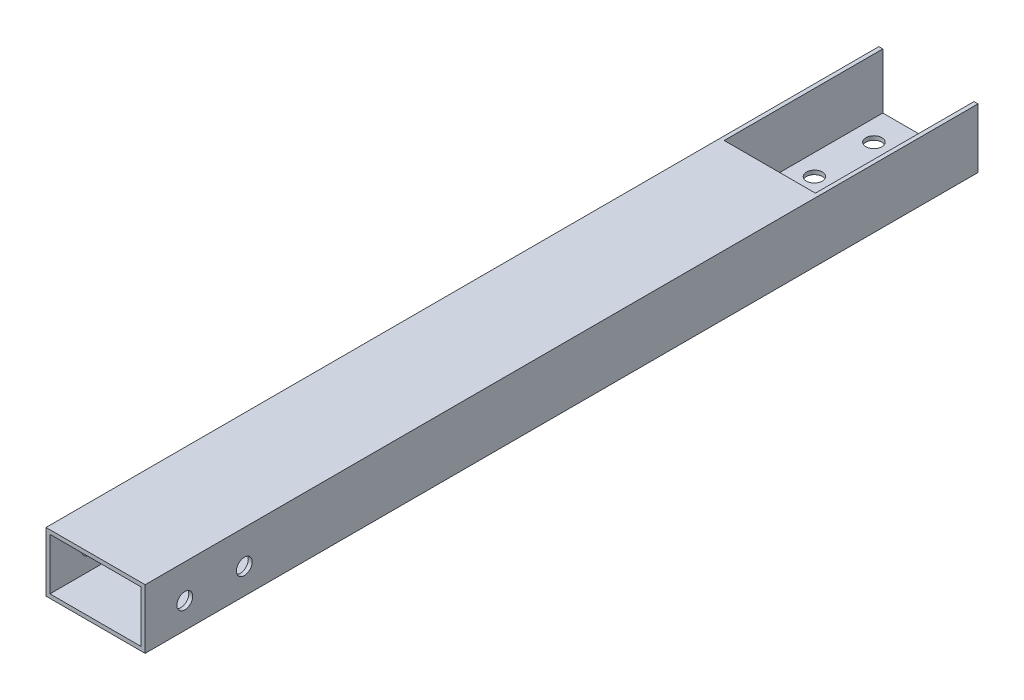
ISO-10303-21;
HEADER;
FILE_DESCRIPTION(('STEP AP214'),'2;1');
FILE_NAME('part.step','',(''),(''),'','','');
FILE_SCHEMA(('AUTOMOTIVE_DESIGN { 1 0 10303 214 1 1 1 1 }'));
ENDSEC;
DATA;
#1=APPLICATION_CONTEXT('core data for automotive mechanical design processes');
#2=APPLICATION_PROTOCOL_DEFINITION('international standard','automotive_design',2000,#1);
#3=PRODUCT_CONTEXT('',#1,'mechanical');
#4=PRODUCT('Part','Part','',(#3));
#5=PRODUCT_RELATED_PRODUCT_CATEGORY('part','',(#4));
#6=PRODUCT_DEFINITION_FORMATION('','',#4);
#7=PRODUCT_DEFINITION_CONTEXT('part definition',#1,'design');
#8=PRODUCT_DEFINITION('design','',#6,#7);
#9=PRODUCT_DEFINITION_SHAPE('','',#8);
#10=(LENGTH_UNIT() NAMED_UNIT(*) SI_UNIT(.MILLI.,.METRE.));
#11=(NAMED_UNIT(*) PLANE_ANGLE_UNIT() SI_UNIT($,.RADIAN.));
#12=(NAMED_UNIT(*) SI_UNIT($,.STERADIAN.) SOLID_ANGLE_UNIT());
#13=UNCERTAINTY_MEASURE_WITH_UNIT(LENGTH_MEASURE(1.E-05),#10,'distance_accuracy_value','');
#14=(GEOMETRIC_REPRESENTATION_CONTEXT(3) GLOBAL_UNCERTAINTY_ASSIGNED_CONTEXT((#13)) GLOBAL_UNIT_ASSIGNED_CONTEXT((#10,
#11,#12)) REPRESENTATION_CONTEXT('',''));
#15=CARTESIAN_POINT('',(0.,0.,0.));
#16=DIRECTION('',(0.,0.,1.));
#17=DIRECTION('',(1.,0.,0.));
#18=AXIS2_PLACEMENT_3D('',#15,#16,#17);
#19=CARTESIAN_POINT('',(0.,0.,420.));
#20=DIRECTION('',(0.,0.,1.));
#21=DIRECTION('',(1.,0.,0.));
#22=AXIS2_PLACEMENT_3D('',#19,#20,#21);
#23=PLANE('',#22);
#24=DIRECTION('',(0.,-1.,0.));
#25=VECTOR('',#24,1.);
#26=CARTESIAN_POINT('',(0.,0.,420.));
#27=LINE('',#26,#25);
#28=CARTESIAN_POINT('',(0.,0.,420.));
#29=VERTEX_POINT('',#28);
#30=CARTESIAN_POINT('',(0.,-30.,420.));
#31=VERTEX_POINT('',#30);
#32=EDGE_CURVE('E212',#29,#31,#27,.T.);
#33=ORIENTED_EDGE('',*,*,#32,.T.);
#34=DIRECTION('',(1.,0.,0.));
#35=VECTOR('',#34,1.);
#36=CARTESIAN_POINT('',(0.,-30.,420.));
#37=LINE('',#36,#35);
#38=CARTESIAN_POINT('',(50.,-30.,420.));
#39=VERTEX_POINT('',#38);
#40=EDGE_CURVE('E215',#31,#39,#37,.T.);
#41=ORIENTED_EDGE('',*,*,#40,.T.);
#42=DIRECTION('',(0.,1.,0.));
#43=VECTOR('',#42,1.);
#44=CARTESIAN_POINT('',(50.,0.,420.));
#45=LINE('',#44,#43);
#46=CARTESIAN_POINT('',(50.,0.,420.));
#47=VERTEX_POINT('',#46);
#48=EDGE_CURVE('E218',#39,#47,#45,.T.);
#49=ORIENTED_EDGE('',*,*,#48,.T.);
#50=DIRECTION('',(-1.,0.,0.));
#51=VECTOR('',#50,1.);
#52=CARTESIAN_POINT('',(0.,0.,420.));
#53=LINE('',#52,#51);
#54=EDGE_CURVE('E220',#47,#29,#53,.T.);
#55=ORIENTED_EDGE('',*,*,#54,.T.);
#56=EDGE_LOOP('',(#33,#41,#49,#55));
#57=FACE_BOUND('',#56,.T.);
#58=DIRECTION('',(1.,0.,0.));
#59=VECTOR('',#58,1.);
#60=CARTESIAN_POINT('',(2.,-28.,420.));
#61=LINE('',#60,#59);
#62=CARTESIAN_POINT('',(2.,-28.,420.));
#63=VERTEX_POINT('',#62);
#64=CARTESIAN_POINT('',(48.,-28.,420.));
#65=VERTEX_POINT('',#64);
#66=EDGE_CURVE('E192',#63,#65,#61,.T.);
#67=ORIENTED_EDGE('',*,*,#66,.F.);
#68=DIRECTION('',(0.,-1.,0.));
#69=VECTOR('',#68,1.);
#70=CARTESIAN_POINT('',(2.,-2.,420.));
#71=LINE('',#70,#69);
#72=CARTESIAN_POINT('',(2.,-2.,420.));
#73=VERTEX_POINT('',#72);
#74=EDGE_CURVE('E190',#73,#63,#71,.T.);
#75=ORIENTED_EDGE('',*,*,#74,.F.);
#76=DIRECTION('',(-1.,0.,0.));
#77=VECTOR('',#76,1.);
#78=CARTESIAN_POINT('',(2.,-2.,420.));
#79=LINE('',#78,#77);
#80=CARTESIAN_POINT('',(48.,-2.,420.));
#81=VERTEX_POINT('',#80);
#82=EDGE_CURVE('E197',#81,#73,#79,.T.);
#83=ORIENTED_EDGE('',*,*,#82,.F.);
#84=DIRECTION('',(0.,1.,0.));
#85=VECTOR('',#84,1.);
#86=CARTESIAN_POINT('',(48.,-2.,420.));
#87=LINE('',#86,#85);
#88=EDGE_CURVE('E195',#65,#81,#87,.T.);
#89=ORIENTED_EDGE('',*,*,#88,.F.);
#90=EDGE_LOOP('',(#67,#75,#83,#89));
#91=FACE_BOUND('',#90,.T.);
#92=ADVANCED_FACE('F41',(#57,#91),#23,.T.);
#93=CARTESIAN_POINT('',(0.,0.,0.));
#94=DIRECTION('',(0.,0.,1.));
#95=DIRECTION('',(1.,0.,0.));
#96=AXIS2_PLACEMENT_3D('',#93,#94,#95);
#97=PLANE('',#96);
#98=DIRECTION('',(0.,1.,0.));
#99=VECTOR('',#98,1.);
#100=CARTESIAN_POINT('',(48.,-2.,0.));
#101=LINE('',#100,#99);
#102=CARTESIAN_POINT('',(48.,-28.,0.));
#103=VERTEX_POINT('',#102);
#104=CARTESIAN_POINT('',(48.,0.,0.));
#105=VERTEX_POINT('',#104);
#106=EDGE_CURVE('E193',#103,#105,#101,.T.);
#107=ORIENTED_EDGE('',*,*,#106,.T.);
#108=DIRECTION('',(-1.,0.,0.));
#109=VECTOR('',#108,1.);
#110=CARTESIAN_POINT('',(0.,0.,0.));
#111=LINE('',#110,#109);
#112=CARTESIAN_POINT('',(50.,0.,0.));
#113=VERTEX_POINT('',#112);
#114=EDGE_CURVE('E216',#113,#105,#111,.T.);
#115=ORIENTED_EDGE('',*,*,#114,.F.);
#116=DIRECTION('',(0.,1.,0.));
#117=VECTOR('',#116,1.);
#118=CARTESIAN_POINT('',(50.,0.,0.));
#119=LINE('',#118,#117);
#120=CARTESIAN_POINT('',(50.,-30.,0.));
#121=VERTEX_POINT('',#120);
#122=EDGE_CURVE('E227',#121,#113,#119,.T.);
#123=ORIENTED_EDGE('',*,*,#122,.F.);
#124=DIRECTION('',(1.,0.,0.));
#125=VECTOR('',#124,1.);
#126=CARTESIAN_POINT('',(0.,-30.,0.));
#127=LINE('',#126,#125);
#128=CARTESIAN_POINT('',(0.,-30.,0.));
#129=VERTEX_POINT('',#128);
#130=EDGE_CURVE('E225',#129,#121,#127,.T.);
#131=ORIENTED_EDGE('',*,*,#130,.F.);
#132=DIRECTION('',(0.,-1.,0.));
#133=VECTOR('',#132,1.);
#134=CARTESIAN_POINT('',(0.,0.,0.));
#135=LINE('',#134,#133);
#136=CARTESIAN_POINT('',(0.,0.,0.));
#137=VERTEX_POINT('',#136);
#138=EDGE_CURVE('E211',#137,#129,#135,.T.);
#139=ORIENTED_EDGE('',*,*,#138,.F.);
#140=CARTESIAN_POINT('',(2.,0.,0.));
#141=VERTEX_POINT('',#140);
#142=EDGE_CURVE('E229',#141,#137,#111,.T.);
#143=ORIENTED_EDGE('',*,*,#142,.F.);
#144=DIRECTION('',(0.,-1.,0.));
#145=VECTOR('',#144,1.);
#146=CARTESIAN_POINT('',(2.,-2.,0.));
#147=LINE('',#146,#145);
#148=CARTESIAN_POINT('',(2.,-28.,0.));
#149=VERTEX_POINT('',#148);
#150=EDGE_CURVE('E135',#141,#149,#147,.T.);
#151=ORIENTED_EDGE('',*,*,#150,.T.);
#152=DIRECTION('',(1.,0.,0.));
#153=VECTOR('',#152,1.);
#154=CARTESIAN_POINT('',(2.,-28.,0.));
#155=LINE('',#154,#153);
#156=EDGE_CURVE('E201',#149,#103,#155,.T.);
#157=ORIENTED_EDGE('',*,*,#156,.T.);
#158=EDGE_LOOP('',(#107,#115,#123,#131,#139,#143,#151,#157));
#159=FACE_BOUND('',#158,.T.);
#160=ADVANCED_FACE('F255',(#159),#97,.F.);
#161=CARTESIAN_POINT('',(0.,0.,420.));
#162=DIRECTION('',(1.,0.,0.));
#163=DIRECTION('',(0.,1.,0.));
#164=AXIS2_PLACEMENT_3D('',#161,#162,#163);
#165=PLANE('',#164);
#166=CARTESIAN_POINT('',(0.,-17.,400.));
#167=DIRECTION('',(1.,0.,0.));
#168=DIRECTION('',(0.,1.,0.));
#169=AXIS2_PLACEMENT_3D('',#166,#167,#168);
#170=CIRCLE('',#169,3.99999999999999);
#171=CARTESIAN_POINT('',(0.,-13.,400.));
#172=VERTEX_POINT('',#171);
#173=EDGE_CURVE('E148',#172,#172,#170,.T.);
#174=ORIENTED_EDGE('',*,*,#173,.T.);
#175=EDGE_LOOP('',(#174));
#176=FACE_BOUND('',#175,.T.);
#177=CARTESIAN_POINT('',(0.,-17.,370.));
#178=DIRECTION('',(1.,0.,0.));
#179=DIRECTION('',(0.,1.,0.));
#180=AXIS2_PLACEMENT_3D('',#177,#178,#179);
#181=CIRCLE('',#180,3.99999999999999);
#182=CARTESIAN_POINT('',(0.,-13.,370.));
#183=VERTEX_POINT('',#182);
#184=EDGE_CURVE('E155',#183,#183,#181,.T.);
#185=ORIENTED_EDGE('',*,*,#184,.T.);
#186=EDGE_LOOP('',(#185));
#187=FACE_BOUND('',#186,.T.);
#188=ORIENTED_EDGE('',*,*,#138,.T.);
#189=DIRECTION('',(0.,0.,-1.));
#190=VECTOR('',#189,1.);
#191=CARTESIAN_POINT('',(0.,-30.,420.));
#192=LINE('',#191,#190);
#193=EDGE_CURVE('E11',#31,#129,#192,.T.);
#194=ORIENTED_EDGE('',*,*,#193,.F.);
#195=ORIENTED_EDGE('',*,*,#32,.F.);
#196=DIRECTION('',(0.,0.,-1.));
#197=VECTOR('',#196,1.);
#198=CARTESIAN_POINT('',(0.,0.,420.));
#199=LINE('',#198,#197);
#200=EDGE_CURVE('E222',#29,#137,#199,.T.);
#201=ORIENTED_EDGE('',*,*,#200,.T.);
#202=EDGE_LOOP('',(#188,#194,#195,#201));
#203=FACE_BOUND('',#202,.T.);
#204=ADVANCED_FACE('F43',(#176,#187,#203),#165,.F.);
#205=CARTESIAN_POINT('',(0.,-30.,420.));
#206=DIRECTION('',(0.,1.,0.));
#207=DIRECTION('',(0.,0.,1.));
#208=AXIS2_PLACEMENT_3D('',#205,#206,#207);
#209=PLANE('',#208);
#210=CARTESIAN_POINT('',(37.5,-30.,15.));
#211=DIRECTION('',(0.,1.,0.));
#212=DIRECTION('',(0.,0.,1.));
#213=AXIS2_PLACEMENT_3D('',#210,#211,#212);
#214=CIRCLE('',#213,4.00000000000001);
#215=CARTESIAN_POINT('',(37.5,-30.,19.));
#216=VERTEX_POINT('',#215);
#217=EDGE_CURVE('E180',#216,#216,#214,.T.);
#218=ORIENTED_EDGE('',*,*,#217,.T.);
#219=EDGE_LOOP('',(#218));
#220=FACE_BOUND('',#219,.T.);
#221=CARTESIAN_POINT('',(12.5,-30.,15.));
#222=DIRECTION('',(0.,1.,0.));
#223=DIRECTION('',(0.,0.,1.));
#224=AXIS2_PLACEMENT_3D('',#221,#222,#223);
#225=CIRCLE('',#224,4.);
#226=CARTESIAN_POINT('',(12.5,-30.,19.));
#227=VERTEX_POINT('',#226);
#228=EDGE_CURVE('E174',#227,#227,#225,.T.);
#229=ORIENTED_EDGE('',*,*,#228,.T.);
#230=EDGE_LOOP('',(#229));
#231=FACE_BOUND('',#230,.T.);
#232=CARTESIAN_POINT('',(12.5,-30.,45.));
#233=DIRECTION('',(0.,1.,0.));
#234=DIRECTION('',(0.,0.,1.));
#235=AXIS2_PLACEMENT_3D('',#232,#233,#234);
#236=CIRCLE('',#235,4.);
#237=CARTESIAN_POINT('',(12.5,-30.,49.));
#238=VERTEX_POINT('',#237);
#239=EDGE_CURVE('E167',#238,#238,#236,.T.);
#240=ORIENTED_EDGE('',*,*,#239,.T.);
#241=EDGE_LOOP('',(#240));
#242=FACE_BOUND('',#241,.T.);
#243=CARTESIAN_POINT('',(37.5,-30.,45.));
#244=DIRECTION('',(0.,1.,0.));
#245=DIRECTION('',(0.,0.,1.));
#246=AXIS2_PLACEMENT_3D('',#243,#244,#245);
#247=CIRCLE('',#246,4.00000000000001);
#248=CARTESIAN_POINT('',(37.5,-30.,49.));
#249=VERTEX_POINT('',#248);
#250=EDGE_CURVE('E185',#249,#249,#247,.T.);
#251=ORIENTED_EDGE('',*,*,#250,.T.);
#252=EDGE_LOOP('',(#251));
#253=FACE_BOUND('',#252,.T.);
#254=ORIENTED_EDGE('',*,*,#130,.T.);
#255=DIRECTION('',(0.,0.,-1.));
#256=VECTOR('',#255,1.);
#257=CARTESIAN_POINT('',(50.,-30.,420.));
#258=LINE('',#257,#256);
#259=EDGE_CURVE('E50',#39,#121,#258,.T.);
#260=ORIENTED_EDGE('',*,*,#259,.F.);
#261=ORIENTED_EDGE('',*,*,#40,.F.);
#262=ORIENTED_EDGE('',*,*,#193,.T.);
#263=EDGE_LOOP('',(#254,#260,#261,#262));
#264=FACE_BOUND('',#263,.T.);
#265=ADVANCED_FACE('F287',(#220,#231,#242,#253,#264),#209,.F.);
#266=CARTESIAN_POINT('',(50.,0.,420.));
#267=DIRECTION('',(-1.,0.,0.));
#268=DIRECTION('',(0.,-1.,0.));
#269=AXIS2_PLACEMENT_3D('',#266,#267,#268);
#270=PLANE('',#269);
#271=CARTESIAN_POINT('',(50.,-17.,400.));
#272=DIRECTION('',(1.,0.,0.));
#273=DIRECTION('',(0.,1.,0.));
#274=AXIS2_PLACEMENT_3D('',#271,#272,#273);
#275=CIRCLE('',#274,3.99999999999999);
#276=CARTESIAN_POINT('',(50.,-13.,400.));
#277=VERTEX_POINT('',#276);
#278=EDGE_CURVE('E152',#277,#277,#275,.T.);
#279=ORIENTED_EDGE('',*,*,#278,.F.);
#280=EDGE_LOOP('',(#279));
#281=FACE_BOUND('',#280,.T.);
#282=CARTESIAN_POINT('',(50.,-17.,370.));
#283=DIRECTION('',(1.,0.,0.));
#284=DIRECTION('',(0.,1.,0.));
#285=AXIS2_PLACEMENT_3D('',#282,#283,#284);
#286=CIRCLE('',#285,3.99999999999999);
#287=CARTESIAN_POINT('',(50.,-13.,370.));
#288=VERTEX_POINT('',#287);
#289=EDGE_CURVE('E147',#288,#288,#286,.T.);
#290=ORIENTED_EDGE('',*,*,#289,.F.);
#291=EDGE_LOOP('',(#290));
#292=FACE_BOUND('',#291,.T.);
#293=ORIENTED_EDGE('',*,*,#122,.T.);
#294=DIRECTION('',(0.,0.,-1.));
#295=VECTOR('',#294,1.);
#296=CARTESIAN_POINT('',(50.,0.,420.));
#297=LINE('',#296,#295);
#298=EDGE_CURVE('E233',#47,#113,#297,.T.);
#299=ORIENTED_EDGE('',*,*,#298,.F.);
#300=ORIENTED_EDGE('',*,*,#48,.F.);
#301=ORIENTED_EDGE('',*,*,#259,.T.);
#302=EDGE_LOOP('',(#293,#299,#300,#301));
#303=FACE_BOUND('',#302,.T.);
#304=ADVANCED_FACE('F285',(#281,#292,#303),#270,.F.);
#305=CARTESIAN_POINT('',(0.,0.,420.));
#306=DIRECTION('',(0.,-1.,0.));
#307=DIRECTION('',(0.,0.,-1.));
#308=AXIS2_PLACEMENT_3D('',#305,#306,#307);
#309=PLANE('',#308);
#310=ORIENTED_EDGE('',*,*,#114,.T.);
#311=DIRECTION('',(0.,0.,-1.));
#312=VECTOR('',#311,1.);
#313=CARTESIAN_POINT('',(48.,0.,0.));
#314=LINE('',#313,#312);
#315=CARTESIAN_POINT('',(48.,0.,80.));
#316=VERTEX_POINT('',#315);
#317=EDGE_CURVE('E128',#316,#105,#314,.T.);
#318=ORIENTED_EDGE('',*,*,#317,.F.);
#319=DIRECTION('',(1.,0.,0.));
#320=VECTOR('',#319,1.);
#321=CARTESIAN_POINT('',(48.,0.,80.));
#322=LINE('',#321,#320);
#323=CARTESIAN_POINT('',(2.,0.,80.));
#324=VERTEX_POINT('',#323);
#325=EDGE_CURVE('E123',#324,#316,#322,.T.);
#326=ORIENTED_EDGE('',*,*,#325,.F.);
#327=DIRECTION('',(0.,0.,1.));
#328=VECTOR('',#327,1.);
#329=CARTESIAN_POINT('',(2.,0.,80.));
#330=LINE('',#329,#328);
#331=EDGE_CURVE('E131',#141,#324,#330,.T.);
#332=ORIENTED_EDGE('',*,*,#331,.F.);
#333=ORIENTED_EDGE('',*,*,#142,.T.);
#334=ORIENTED_EDGE('',*,*,#200,.F.);
#335=ORIENTED_EDGE('',*,*,#54,.F.);
#336=ORIENTED_EDGE('',*,*,#298,.T.);
#337=EDGE_LOOP('',(#310,#318,#326,#332,#333,#334,#335,#336));
#338=FACE_BOUND('',#337,.T.);
#339=ADVANCED_FACE('F140',(#338),#309,.F.);
#340=CARTESIAN_POINT('',(2.,-2.,420.));
#341=DIRECTION('',(1.,0.,0.));
#342=DIRECTION('',(0.,1.,0.));
#343=AXIS2_PLACEMENT_3D('',#340,#341,#342);
#344=PLANE('',#343);
#345=CARTESIAN_POINT('',(2.,-17.,400.));
#346=DIRECTION('',(1.,0.,0.));
#347=DIRECTION('',(0.,1.,0.));
#348=AXIS2_PLACEMENT_3D('',#345,#346,#347);
#349=CIRCLE('',#348,3.99999999999999);
#350=CARTESIAN_POINT('',(2.,-13.,400.));
#351=VERTEX_POINT('',#350);
#352=EDGE_CURVE('E163',#351,#351,#349,.T.);
#353=ORIENTED_EDGE('',*,*,#352,.F.);
#354=EDGE_LOOP('',(#353));
#355=FACE_BOUND('',#354,.T.);
#356=CARTESIAN_POINT('',(2.,-17.,370.));
#357=DIRECTION('',(1.,0.,0.));
#358=DIRECTION('',(0.,1.,0.));
#359=AXIS2_PLACEMENT_3D('',#356,#357,#358);
#360=CIRCLE('',#359,3.99999999999999);
#361=CARTESIAN_POINT('',(2.,-13.,370.));
#362=VERTEX_POINT('',#361);
#363=EDGE_CURVE('E160',#362,#362,#360,.T.);
#364=ORIENTED_EDGE('',*,*,#363,.F.);
#365=EDGE_LOOP('',(#364));
#366=FACE_BOUND('',#365,.T.);
#367=ORIENTED_EDGE('',*,*,#150,.F.);
#368=ORIENTED_EDGE('',*,*,#331,.T.);
#369=DIRECTION('',(0.,1.,0.));
#370=VECTOR('',#369,1.);
#371=CARTESIAN_POINT('',(2.,-30.001,80.));
#372=LINE('',#371,#370);
#373=CARTESIAN_POINT('',(2.,-2.,80.));
#374=VERTEX_POINT('',#373);
#375=EDGE_CURVE('E58',#374,#324,#372,.T.);
#376=ORIENTED_EDGE('',*,*,#375,.F.);
#377=DIRECTION('',(0.,0.,-1.));
#378=VECTOR('',#377,1.);
#379=CARTESIAN_POINT('',(2.,-2.,420.));
#380=LINE('',#379,#378);
#381=EDGE_CURVE('E199',#73,#374,#380,.T.);
#382=ORIENTED_EDGE('',*,*,#381,.F.);
#383=ORIENTED_EDGE('',*,*,#74,.T.);
#384=DIRECTION('',(0.,0.,-1.));
#385=VECTOR('',#384,1.);
#386=CARTESIAN_POINT('',(2.,-28.,420.));
#387=LINE('',#386,#385);
#388=EDGE_CURVE('E209',#63,#149,#387,.T.);
#389=ORIENTED_EDGE('',*,*,#388,.T.);
#390=EDGE_LOOP('',(#367,#368,#376,#382,#383,#389));
#391=FACE_BOUND('',#390,.T.);
#392=ADVANCED_FACE('F132',(#355,#366,#391),#344,.T.);
#393=CARTESIAN_POINT('',(2.,-28.,420.));
#394=DIRECTION('',(0.,1.,0.));
#395=DIRECTION('',(0.,0.,1.));
#396=AXIS2_PLACEMENT_3D('',#393,#394,#395);
#397=PLANE('',#396);
#398=CARTESIAN_POINT('',(37.5,-28.,15.));
#399=DIRECTION('',(0.,1.,0.));
#400=DIRECTION('',(0.,0.,1.));
#401=AXIS2_PLACEMENT_3D('',#398,#399,#400);
#402=CIRCLE('',#401,4.00000000000001);
#403=CARTESIAN_POINT('',(37.5,-28.,19.));
#404=VERTEX_POINT('',#403);
#405=EDGE_CURVE('E166',#404,#404,#402,.T.);
#406=ORIENTED_EDGE('',*,*,#405,.F.);
#407=EDGE_LOOP('',(#406));
#408=FACE_BOUND('',#407,.T.);
#409=CARTESIAN_POINT('',(12.5,-28.,15.));
#410=DIRECTION('',(0.,1.,0.));
#411=DIRECTION('',(0.,0.,1.));
#412=AXIS2_PLACEMENT_3D('',#409,#410,#411);
#413=CIRCLE('',#412,4.);
#414=CARTESIAN_POINT('',(12.5,-28.,19.));
#415=VERTEX_POINT('',#414);
#416=EDGE_CURVE('E177',#415,#415,#413,.T.);
#417=ORIENTED_EDGE('',*,*,#416,.F.);
#418=EDGE_LOOP('',(#417));
#419=FACE_BOUND('',#418,.T.);
#420=CARTESIAN_POINT('',(12.5,-28.,45.));
#421=DIRECTION('',(0.,1.,0.));
#422=DIRECTION('',(0.,0.,1.));
#423=AXIS2_PLACEMENT_3D('',#420,#421,#422);
#424=CIRCLE('',#423,4.);
#425=CARTESIAN_POINT('',(12.5,-28.,49.));
#426=VERTEX_POINT('',#425);
#427=EDGE_CURVE('E171',#426,#426,#424,.T.);
#428=ORIENTED_EDGE('',*,*,#427,.F.);
#429=EDGE_LOOP('',(#428));
#430=FACE_BOUND('',#429,.T.);
#431=CARTESIAN_POINT('',(37.5,-28.,45.));
#432=DIRECTION('',(0.,1.,0.));
#433=DIRECTION('',(0.,0.,1.));
#434=AXIS2_PLACEMENT_3D('',#431,#432,#433);
#435=CIRCLE('',#434,4.00000000000001);
#436=CARTESIAN_POINT('',(37.5,-28.,49.));
#437=VERTEX_POINT('',#436);
#438=EDGE_CURVE('E170',#437,#437,#435,.T.);
#439=ORIENTED_EDGE('',*,*,#438,.F.);
#440=EDGE_LOOP('',(#439));
#441=FACE_BOUND('',#440,.T.);
#442=ORIENTED_EDGE('',*,*,#156,.F.);
#443=ORIENTED_EDGE('',*,*,#388,.F.);
#444=ORIENTED_EDGE('',*,*,#66,.T.);
#445=DIRECTION('',(0.,0.,-1.));
#446=VECTOR('',#445,1.);
#447=CARTESIAN_POINT('',(48.,-28.,420.));
#448=LINE('',#447,#446);
#449=EDGE_CURVE('E207',#65,#103,#448,.T.);
#450=ORIENTED_EDGE('',*,*,#449,.T.);
#451=EDGE_LOOP('',(#442,#443,#444,#450));
#452=FACE_BOUND('',#451,.T.);
#453=ADVANCED_FACE('F247',(#408,#419,#430,#441,#452),#397,.T.);
#454=CARTESIAN_POINT('',(48.,-2.,420.));
#455=DIRECTION('',(-1.,0.,0.));
#456=DIRECTION('',(0.,0.,1.));
#457=AXIS2_PLACEMENT_3D('',#454,#455,#456);
#458=PLANE('',#457);
#459=CARTESIAN_POINT('',(48.,-17.,400.));
#460=DIRECTION('',(-1.,0.,0.));
#461=DIRECTION('',(0.,0.,1.));
#462=AXIS2_PLACEMENT_3D('',#459,#460,#461);
#463=CIRCLE('',#462,3.99999999999999);
#464=CARTESIAN_POINT('',(48.,-17.,404.));
#465=VERTEX_POINT('',#464);
#466=EDGE_CURVE('E45',#465,#465,#463,.T.);
#467=ORIENTED_EDGE('',*,*,#466,.F.);
#468=EDGE_LOOP('',(#467));
#469=FACE_BOUND('',#468,.T.);
#470=CARTESIAN_POINT('',(48.,-17.,370.));
#471=DIRECTION('',(-1.,0.,0.));
#472=DIRECTION('',(0.,0.,1.));
#473=AXIS2_PLACEMENT_3D('',#470,#471,#472);
#474=CIRCLE('',#473,3.99999999999999);
#475=CARTESIAN_POINT('',(48.,-17.,374.));
#476=VERTEX_POINT('',#475);
#477=EDGE_CURVE('E151',#476,#476,#474,.T.);
#478=ORIENTED_EDGE('',*,*,#477,.F.);
#479=EDGE_LOOP('',(#478));
#480=FACE_BOUND('',#479,.T.);
#481=ORIENTED_EDGE('',*,*,#106,.F.);
#482=ORIENTED_EDGE('',*,*,#449,.F.);
#483=ORIENTED_EDGE('',*,*,#88,.T.);
#484=DIRECTION('',(0.,0.,-1.));
#485=VECTOR('',#484,1.);
#486=CARTESIAN_POINT('',(48.,-2.,420.));
#487=LINE('',#486,#485);
#488=CARTESIAN_POINT('',(48.,-2.,80.));
#489=VERTEX_POINT('',#488);
#490=EDGE_CURVE('E66',#81,#489,#487,.T.);
#491=ORIENTED_EDGE('',*,*,#490,.T.);
#492=DIRECTION('',(0.,1.,0.));
#493=VECTOR('',#492,1.);
#494=CARTESIAN_POINT('',(48.,-30.001,80.));
#495=LINE('',#494,#493);
#496=EDGE_CURVE('E127',#489,#316,#495,.T.);
#497=ORIENTED_EDGE('',*,*,#496,.T.);
#498=ORIENTED_EDGE('',*,*,#317,.T.);
#499=EDGE_LOOP('',(#481,#482,#483,#491,#497,#498));
#500=FACE_BOUND('',#499,.T.);
#501=ADVANCED_FACE('F243',(#469,#480,#500),#458,.T.);
#502=CARTESIAN_POINT('',(2.,-2.,420.));
#503=DIRECTION('',(0.,-1.,0.));
#504=DIRECTION('',(0.,0.,-1.));
#505=AXIS2_PLACEMENT_3D('',#502,#503,#504);
#506=PLANE('',#505);
#507=DIRECTION('',(1.,0.,0.));
#508=VECTOR('',#507,1.);
#509=CARTESIAN_POINT('',(48.,-2.,80.));
#510=LINE('',#509,#508);
#511=EDGE_CURVE('E125',#374,#489,#510,.T.);
#512=ORIENTED_EDGE('',*,*,#511,.T.);
#513=ORIENTED_EDGE('',*,*,#490,.F.);
#514=ORIENTED_EDGE('',*,*,#82,.T.);
#515=ORIENTED_EDGE('',*,*,#381,.T.);
#516=EDGE_LOOP('',(#512,#513,#514,#515));
#517=FACE_BOUND('',#516,.T.);
#518=ADVANCED_FACE('F246',(#517),#506,.T.);
#519=CARTESIAN_POINT('',(37.5,-30.,45.));
#520=DIRECTION('',(0.,1.,0.));
#521=DIRECTION('',(0.,0.,1.));
#522=AXIS2_PLACEMENT_3D('',#519,#520,#521);
#523=CYLINDRICAL_SURFACE('',#522,4.00000000000001);
#524=ORIENTED_EDGE('',*,*,#250,.F.);
#525=EDGE_LOOP('',(#524));
#526=FACE_BOUND('',#525,.T.);
#527=ORIENTED_EDGE('',*,*,#438,.T.);
#528=EDGE_LOOP('',(#527));
#529=FACE_BOUND('',#528,.T.);
#530=ADVANCED_FACE('F263',(#526,#529),#523,.F.);
#531=CARTESIAN_POINT('',(12.5,-30.,45.));
#532=DIRECTION('',(0.,1.,0.));
#533=DIRECTION('',(0.,0.,1.));
#534=AXIS2_PLACEMENT_3D('',#531,#532,#533);
#535=CYLINDRICAL_SURFACE('',#534,4.);
#536=ORIENTED_EDGE('',*,*,#239,.F.);
#537=EDGE_LOOP('',(#536));
#538=FACE_BOUND('',#537,.T.);
#539=ORIENTED_EDGE('',*,*,#427,.T.);
#540=EDGE_LOOP('',(#539));
#541=FACE_BOUND('',#540,.T.);
#542=ADVANCED_FACE('F269',(#538,#541),#535,.F.);
#543=CARTESIAN_POINT('',(12.5,-30.,15.));
#544=DIRECTION('',(0.,1.,0.));
#545=DIRECTION('',(0.,0.,1.));
#546=AXIS2_PLACEMENT_3D('',#543,#544,#545);
#547=CYLINDRICAL_SURFACE('',#546,4.);
#548=ORIENTED_EDGE('',*,*,#228,.F.);
#549=EDGE_LOOP('',(#548));
#550=FACE_BOUND('',#549,.T.);
#551=ORIENTED_EDGE('',*,*,#416,.T.);
#552=EDGE_LOOP('',(#551));
#553=FACE_BOUND('',#552,.T.);
#554=ADVANCED_FACE('F329',(#550,#553),#547,.F.);
#555=CARTESIAN_POINT('',(37.5,-30.,15.));
#556=DIRECTION('',(0.,1.,0.));
#557=DIRECTION('',(0.,0.,1.));
#558=AXIS2_PLACEMENT_3D('',#555,#556,#557);
#559=CYLINDRICAL_SURFACE('',#558,4.00000000000001);
#560=ORIENTED_EDGE('',*,*,#217,.F.);
#561=EDGE_LOOP('',(#560));
#562=FACE_BOUND('',#561,.T.);
#563=ORIENTED_EDGE('',*,*,#405,.T.);
#564=EDGE_LOOP('',(#563));
#565=FACE_BOUND('',#564,.T.);
#566=ADVANCED_FACE('F335',(#562,#565),#559,.F.);
#567=CARTESIAN_POINT('',(0.,-17.,370.));
#568=DIRECTION('',(1.,0.,0.));
#569=DIRECTION('',(0.,1.,0.));
#570=AXIS2_PLACEMENT_3D('',#567,#568,#569);
#571=CYLINDRICAL_SURFACE('',#570,3.99999999999999);
#572=ORIENTED_EDGE('',*,*,#477,.T.);
#573=EDGE_LOOP('',(#572));
#574=FACE_BOUND('',#573,.T.);
#575=ORIENTED_EDGE('',*,*,#289,.T.);
#576=EDGE_LOOP('',(#575));
#577=FACE_BOUND('',#576,.T.);
#578=ADVANCED_FACE('F240',(#574,#577),#571,.F.);
#579=CARTESIAN_POINT('',(0.,-17.,400.));
#580=DIRECTION('',(1.,0.,0.));
#581=DIRECTION('',(0.,1.,0.));
#582=AXIS2_PLACEMENT_3D('',#579,#580,#581);
#583=CYLINDRICAL_SURFACE('',#582,3.99999999999999);
#584=ORIENTED_EDGE('',*,*,#466,.T.);
#585=EDGE_LOOP('',(#584));
#586=FACE_BOUND('',#585,.T.);
#587=ORIENTED_EDGE('',*,*,#278,.T.);
#588=EDGE_LOOP('',(#587));
#589=FACE_BOUND('',#588,.T.);
#590=ADVANCED_FACE('F346',(#586,#589),#583,.F.);
#591=ORIENTED_EDGE('',*,*,#363,.T.);
#592=EDGE_LOOP('',(#591));
#593=FACE_BOUND('',#592,.T.);
#594=ORIENTED_EDGE('',*,*,#184,.F.);
#595=EDGE_LOOP('',(#594));
#596=FACE_BOUND('',#595,.T.);
#597=ADVANCED_FACE('F347',(#593,#596),#571,.F.);
#598=ORIENTED_EDGE('',*,*,#352,.T.);
#599=EDGE_LOOP('',(#598));
#600=FACE_BOUND('',#599,.T.);
#601=ORIENTED_EDGE('',*,*,#173,.F.);
#602=EDGE_LOOP('',(#601));
#603=FACE_BOUND('',#602,.T.);
#604=ADVANCED_FACE('F353',(#600,#603),#583,.F.);
#605=CARTESIAN_POINT('',(48.,-30.001,80.));
#606=DIRECTION('',(0.,0.,1.));
#607=DIRECTION('',(1.,0.,0.));
#608=AXIS2_PLACEMENT_3D('',#605,#606,#607);
#609=PLANE('',#608);
#610=ORIENTED_EDGE('',*,*,#375,.T.);
#611=ORIENTED_EDGE('',*,*,#325,.T.);
#612=ORIENTED_EDGE('',*,*,#496,.F.);
#613=ORIENTED_EDGE('',*,*,#511,.F.);
#614=EDGE_LOOP('',(#610,#611,#612,#613));
#615=FACE_BOUND('',#614,.T.);
#616=ADVANCED_FACE('F121',(#615),#609,.F.);
#617=CLOSED_SHELL('',(#92,#160,#204,#265,#304,#339,#392,#453,#501,#518,#530,#542,#554,#566,#578,
#590,#597,#604,#616));
#618=MANIFOLD_SOLID_BREP('B2',#617);
#619=ADVANCED_BREP_SHAPE_REPRESENTATION('',(#18,#618),#14);
#620=SHAPE_DEFINITION_REPRESENTATION(#9,#619);
ENDSEC;
END-ISO-10303-21;
